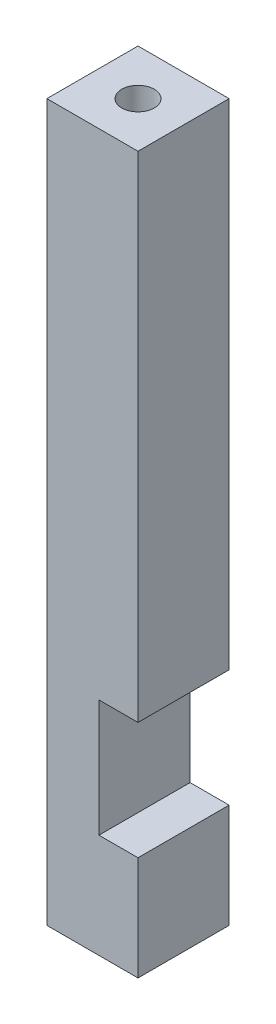
ISO-10303-21;
HEADER;
FILE_DESCRIPTION(('STEP AP214'),'2;1');
FILE_NAME('part.step','',(''),(''),'','','');
FILE_SCHEMA(('AUTOMOTIVE_DESIGN { 1 0 10303 214 1 1 1 1 }'));
ENDSEC;
DATA;
#1=APPLICATION_CONTEXT('core data for automotive mechanical design processes');
#2=APPLICATION_PROTOCOL_DEFINITION('international standard','automotive_design',2000,#1);
#3=PRODUCT_CONTEXT('',#1,'mechanical');
#4=PRODUCT('Part','Part','',(#3));
#5=PRODUCT_RELATED_PRODUCT_CATEGORY('part','',(#4));
#6=PRODUCT_DEFINITION_FORMATION('','',#4);
#7=PRODUCT_DEFINITION_CONTEXT('part definition',#1,'design');
#8=PRODUCT_DEFINITION('design','',#6,#7);
#9=PRODUCT_DEFINITION_SHAPE('','',#8);
#10=(LENGTH_UNIT() NAMED_UNIT(*) SI_UNIT(.MILLI.,.METRE.));
#11=(NAMED_UNIT(*) PLANE_ANGLE_UNIT() SI_UNIT($,.RADIAN.));
#12=(NAMED_UNIT(*) SI_UNIT($,.STERADIAN.) SOLID_ANGLE_UNIT());
#13=UNCERTAINTY_MEASURE_WITH_UNIT(LENGTH_MEASURE(1.E-05),#10,'distance_accuracy_value','');
#14=(GEOMETRIC_REPRESENTATION_CONTEXT(3) GLOBAL_UNCERTAINTY_ASSIGNED_CONTEXT((#13)) GLOBAL_UNIT_ASSIGNED_CONTEXT((#10,
#11,#12)) REPRESENTATION_CONTEXT('',''));
#15=CARTESIAN_POINT('',(0.,0.,0.));
#16=DIRECTION('',(0.,0.,1.));
#17=DIRECTION('',(1.,0.,0.));
#18=AXIS2_PLACEMENT_3D('',#15,#16,#17);
#19=CARTESIAN_POINT('',(3.5,55.,3.5));
#20=DIRECTION('',(-1.,0.,0.));
#21=DIRECTION('',(0.,0.,1.));
#22=AXIS2_PLACEMENT_3D('',#19,#20,#21);
#23=PLANE('',#22);
#24=DIRECTION('',(0.,-1.,0.));
#25=VECTOR('',#24,1.);
#26=CARTESIAN_POINT('',(3.5,55.,-3.5));
#27=LINE('',#26,#25);
#28=CARTESIAN_POINT('',(3.5,8.,-3.5));
#29=VERTEX_POINT('',#28);
#30=CARTESIAN_POINT('',(3.5,0.,-3.5));
#31=VERTEX_POINT('',#30);
#32=EDGE_CURVE('E85',#29,#31,#27,.T.);
#33=ORIENTED_EDGE('',*,*,#32,.F.);
#34=DIRECTION('',(0.,0.,-1.));
#35=VECTOR('',#34,1.);
#36=CARTESIAN_POINT('',(3.5,8.,0.));
#37=LINE('',#36,#35);
#38=CARTESIAN_POINT('',(3.5,8.,3.5));
#39=VERTEX_POINT('',#38);
#40=EDGE_CURVE('E128',#39,#29,#37,.T.);
#41=ORIENTED_EDGE('',*,*,#40,.F.);
#42=DIRECTION('',(0.,-1.,0.));
#43=VECTOR('',#42,1.);
#44=CARTESIAN_POINT('',(3.5,55.,3.5));
#45=LINE('',#44,#43);
#46=CARTESIAN_POINT('',(3.5,0.,3.5));
#47=VERTEX_POINT('',#46);
#48=EDGE_CURVE('E176',#39,#47,#45,.T.);
#49=ORIENTED_EDGE('',*,*,#48,.T.);
#50=DIRECTION('',(0.,0.,-1.));
#51=VECTOR('',#50,1.);
#52=CARTESIAN_POINT('',(3.5,0.,3.5));
#53=LINE('',#52,#51);
#54=EDGE_CURVE('E154',#47,#31,#53,.T.);
#55=ORIENTED_EDGE('',*,*,#54,.T.);
#56=EDGE_LOOP('',(#33,#41,#49,#55));
#57=FACE_BOUND('',#56,.T.);
#58=ADVANCED_FACE('F39',(#57),#23,.F.);
#59=CARTESIAN_POINT('',(0.,55.,-3.5));
#60=DIRECTION('',(0.,0.,1.));
#61=DIRECTION('',(1.,0.,0.));
#62=AXIS2_PLACEMENT_3D('',#59,#60,#61);
#63=PLANE('',#62);
#64=DIRECTION('',(0.,1.,0.));
#65=VECTOR('',#64,1.);
#66=CARTESIAN_POINT('',(0.5,0.,-3.5));
#67=LINE('',#66,#65);
#68=CARTESIAN_POINT('',(0.5,8.,-3.5));
#69=VERTEX_POINT('',#68);
#70=CARTESIAN_POINT('',(0.5,17.,-3.5));
#71=VERTEX_POINT('',#70);
#72=EDGE_CURVE('E120',#69,#71,#67,.T.);
#73=ORIENTED_EDGE('',*,*,#72,.F.);
#74=DIRECTION('',(1.,0.,0.));
#75=VECTOR('',#74,1.);
#76=CARTESIAN_POINT('',(0.5,8.,-3.5));
#77=LINE('',#76,#75);
#78=EDGE_CURVE('E150',#69,#29,#77,.T.);
#79=ORIENTED_EDGE('',*,*,#78,.T.);
#80=ORIENTED_EDGE('',*,*,#32,.T.);
#81=DIRECTION('',(-1.,0.,0.));
#82=VECTOR('',#81,1.);
#83=CARTESIAN_POINT('',(0.,0.,-3.5));
#84=LINE('',#83,#82);
#85=CARTESIAN_POINT('',(-3.5,0.,-3.5));
#86=VERTEX_POINT('',#85);
#87=EDGE_CURVE('E145',#31,#86,#84,.T.);
#88=ORIENTED_EDGE('',*,*,#87,.T.);
#89=DIRECTION('',(0.,-1.,0.));
#90=VECTOR('',#89,1.);
#91=CARTESIAN_POINT('',(-3.5,55.,-3.5));
#92=LINE('',#91,#90);
#93=CARTESIAN_POINT('',(-3.5,55.,-3.5));
#94=VERTEX_POINT('',#93);
#95=EDGE_CURVE('E11',#94,#86,#92,.T.);
#96=ORIENTED_EDGE('',*,*,#95,.F.);
#97=DIRECTION('',(-1.,0.,0.));
#98=VECTOR('',#97,1.);
#99=CARTESIAN_POINT('',(3.5,55.,-3.5));
#100=LINE('',#99,#98);
#101=CARTESIAN_POINT('',(3.5,55.,-3.5));
#102=VERTEX_POINT('',#101);
#103=EDGE_CURVE('E90',#102,#94,#100,.T.);
#104=ORIENTED_EDGE('',*,*,#103,.F.);
#105=CARTESIAN_POINT('',(3.5,17.,-3.5));
#106=VERTEX_POINT('',#105);
#107=EDGE_CURVE('E131',#102,#106,#27,.T.);
#108=ORIENTED_EDGE('',*,*,#107,.T.);
#109=DIRECTION('',(1.,0.,0.));
#110=VECTOR('',#109,1.);
#111=CARTESIAN_POINT('',(0.5,17.,-3.5));
#112=LINE('',#111,#110);
#113=EDGE_CURVE('E55',#71,#106,#112,.T.);
#114=ORIENTED_EDGE('',*,*,#113,.F.);
#115=EDGE_LOOP('',(#73,#79,#80,#88,#96,#104,#108,#114));
#116=FACE_BOUND('',#115,.T.);
#117=ADVANCED_FACE('F41',(#116),#63,.F.);
#118=CARTESIAN_POINT('',(-3.5,55.,-3.5));
#119=DIRECTION('',(1.,0.,0.));
#120=DIRECTION('',(0.,0.,-1.));
#121=AXIS2_PLACEMENT_3D('',#118,#119,#120);
#122=PLANE('',#121);
#123=DIRECTION('',(0.,0.,1.));
#124=VECTOR('',#123,1.);
#125=CARTESIAN_POINT('',(-3.5,0.,-3.5));
#126=LINE('',#125,#124);
#127=CARTESIAN_POINT('',(-3.5,0.,3.5));
#128=VERTEX_POINT('',#127);
#129=EDGE_CURVE('E164',#86,#128,#126,.T.);
#130=ORIENTED_EDGE('',*,*,#129,.T.);
#131=DIRECTION('',(0.,-1.,0.));
#132=VECTOR('',#131,1.);
#133=CARTESIAN_POINT('',(-3.5,55.,3.5));
#134=LINE('',#133,#132);
#135=CARTESIAN_POINT('',(-3.5,55.,3.5));
#136=VERTEX_POINT('',#135);
#137=EDGE_CURVE('E48',#136,#128,#134,.T.);
#138=ORIENTED_EDGE('',*,*,#137,.F.);
#139=DIRECTION('',(0.,0.,1.));
#140=VECTOR('',#139,1.);
#141=CARTESIAN_POINT('',(-3.5,55.,-3.5));
#142=LINE('',#141,#140);
#143=EDGE_CURVE('E153',#94,#136,#142,.T.);
#144=ORIENTED_EDGE('',*,*,#143,.F.);
#145=ORIENTED_EDGE('',*,*,#95,.T.);
#146=EDGE_LOOP('',(#130,#138,#144,#145));
#147=FACE_BOUND('',#146,.T.);
#148=ADVANCED_FACE('F248',(#147),#122,.F.);
#149=CARTESIAN_POINT('',(-3.5,55.,3.5));
#150=DIRECTION('',(0.,0.,-1.));
#151=DIRECTION('',(-1.,0.,0.));
#152=AXIS2_PLACEMENT_3D('',#149,#150,#151);
#153=PLANE('',#152);
#154=ORIENTED_EDGE('',*,*,#48,.F.);
#155=DIRECTION('',(1.,0.,0.));
#156=VECTOR('',#155,1.);
#157=CARTESIAN_POINT('',(0.5,8.,3.5));
#158=LINE('',#157,#156);
#159=CARTESIAN_POINT('',(0.5,8.,3.5));
#160=VERTEX_POINT('',#159);
#161=EDGE_CURVE('E136',#160,#39,#158,.T.);
#162=ORIENTED_EDGE('',*,*,#161,.F.);
#163=DIRECTION('',(0.,-1.,0.));
#164=VECTOR('',#163,1.);
#165=CARTESIAN_POINT('',(0.5,0.,3.5));
#166=LINE('',#165,#164);
#167=CARTESIAN_POINT('',(0.5,17.,3.5));
#168=VERTEX_POINT('',#167);
#169=EDGE_CURVE('E119',#168,#160,#166,.T.);
#170=ORIENTED_EDGE('',*,*,#169,.F.);
#171=DIRECTION('',(1.,0.,0.));
#172=VECTOR('',#171,1.);
#173=CARTESIAN_POINT('',(0.5,17.,3.5));
#174=LINE('',#173,#172);
#175=CARTESIAN_POINT('',(3.5,17.,3.5));
#176=VERTEX_POINT('',#175);
#177=EDGE_CURVE('E115',#168,#176,#174,.T.);
#178=ORIENTED_EDGE('',*,*,#177,.T.);
#179=CARTESIAN_POINT('',(3.5,55.,3.5));
#180=VERTEX_POINT('',#179);
#181=EDGE_CURVE('E177',#180,#176,#45,.T.);
#182=ORIENTED_EDGE('',*,*,#181,.F.);
#183=DIRECTION('',(1.,0.,0.));
#184=VECTOR('',#183,1.);
#185=CARTESIAN_POINT('',(-3.5,55.,3.5));
#186=LINE('',#185,#184);
#187=EDGE_CURVE('E157',#136,#180,#186,.T.);
#188=ORIENTED_EDGE('',*,*,#187,.F.);
#189=ORIENTED_EDGE('',*,*,#137,.T.);
#190=DIRECTION('',(1.,0.,0.));
#191=VECTOR('',#190,1.);
#192=CARTESIAN_POINT('',(-3.5,0.,3.5));
#193=LINE('',#192,#191);
#194=EDGE_CURVE('E167',#128,#47,#193,.T.);
#195=ORIENTED_EDGE('',*,*,#194,.T.);
#196=EDGE_LOOP('',(#154,#162,#170,#178,#182,#188,#189,#195));
#197=FACE_BOUND('',#196,.T.);
#198=ADVANCED_FACE('F187',(#197),#153,.F.);
#199=ORIENTED_EDGE('',*,*,#181,.T.);
#200=DIRECTION('',(0.,0.,1.));
#201=VECTOR('',#200,1.);
#202=CARTESIAN_POINT('',(3.5,17.,0.));
#203=LINE('',#202,#201);
#204=EDGE_CURVE('E207',#106,#176,#203,.T.);
#205=ORIENTED_EDGE('',*,*,#204,.F.);
#206=ORIENTED_EDGE('',*,*,#107,.F.);
#207=DIRECTION('',(0.,0.,-1.));
#208=VECTOR('',#207,1.);
#209=CARTESIAN_POINT('',(3.5,55.,3.5));
#210=LINE('',#209,#208);
#211=EDGE_CURVE('E64',#180,#102,#210,.T.);
#212=ORIENTED_EDGE('',*,*,#211,.F.);
#213=EDGE_LOOP('',(#199,#205,#206,#212));
#214=FACE_BOUND('',#213,.T.);
#215=ADVANCED_FACE('F240',(#214),#23,.F.);
#216=CARTESIAN_POINT('',(0.,55.,0.));
#217=DIRECTION('',(0.,1.,0.));
#218=DIRECTION('',(0.,0.,1.));
#219=AXIS2_PLACEMENT_3D('',#216,#217,#218);
#220=PLANE('',#219);
#221=CARTESIAN_POINT('',(0.,55.,0.));
#222=DIRECTION('',(0.,1.,0.));
#223=DIRECTION('',(0.,0.,1.));
#224=AXIS2_PLACEMENT_3D('',#221,#222,#223);
#225=CIRCLE('',#224,1.25);
#226=CARTESIAN_POINT('',(0.,55.,1.25));
#227=VERTEX_POINT('',#226);
#228=EDGE_CURVE('E146',#227,#227,#225,.T.);
#229=ORIENTED_EDGE('',*,*,#228,.F.);
#230=EDGE_LOOP('',(#229));
#231=FACE_BOUND('',#230,.T.);
#232=ORIENTED_EDGE('',*,*,#103,.T.);
#233=ORIENTED_EDGE('',*,*,#143,.T.);
#234=ORIENTED_EDGE('',*,*,#187,.T.);
#235=ORIENTED_EDGE('',*,*,#211,.T.);
#236=EDGE_LOOP('',(#232,#233,#234,#235));
#237=FACE_BOUND('',#236,.T.);
#238=ADVANCED_FACE('F231',(#231,#237),#220,.T.);
#239=CARTESIAN_POINT('',(0.,0.,0.));
#240=DIRECTION('',(0.,1.,0.));
#241=DIRECTION('',(0.,0.,1.));
#242=AXIS2_PLACEMENT_3D('',#239,#240,#241);
#243=PLANE('',#242);
#244=CARTESIAN_POINT('',(0.,0.,0.));
#245=DIRECTION('',(0.,-1.,0.));
#246=DIRECTION('',(0.,0.,-1.));
#247=AXIS2_PLACEMENT_3D('',#244,#245,#246);
#248=CIRCLE('',#247,1.25);
#249=CARTESIAN_POINT('',(0.,0.,-1.25));
#250=VERTEX_POINT('',#249);
#251=EDGE_CURVE('E213',#250,#250,#248,.T.);
#252=ORIENTED_EDGE('',*,*,#251,.F.);
#253=EDGE_LOOP('',(#252));
#254=FACE_BOUND('',#253,.T.);
#255=ORIENTED_EDGE('',*,*,#87,.F.);
#256=ORIENTED_EDGE('',*,*,#54,.F.);
#257=ORIENTED_EDGE('',*,*,#194,.F.);
#258=ORIENTED_EDGE('',*,*,#129,.F.);
#259=EDGE_LOOP('',(#255,#256,#257,#258));
#260=FACE_BOUND('',#259,.T.);
#261=ADVANCED_FACE('F194',(#254,#260),#243,.F.);
#262=CARTESIAN_POINT('',(0.,43.,0.));
#263=DIRECTION('',(0.,1.,0.));
#264=DIRECTION('',(0.,0.,1.));
#265=AXIS2_PLACEMENT_3D('',#262,#263,#264);
#266=CYLINDRICAL_SURFACE('',#265,1.25);
#267=CARTESIAN_POINT('',(0.,43.,0.));
#268=DIRECTION('',(0.,1.,0.));
#269=DIRECTION('',(0.,0.,1.));
#270=AXIS2_PLACEMENT_3D('',#267,#268,#269);
#271=CIRCLE('',#270,1.25);
#272=CARTESIAN_POINT('',(0.,43.,1.25));
#273=VERTEX_POINT('',#272);
#274=EDGE_CURVE('E141',#273,#273,#271,.T.);
#275=ORIENTED_EDGE('',*,*,#274,.F.);
#276=EDGE_LOOP('',(#275));
#277=FACE_BOUND('',#276,.T.);
#278=ORIENTED_EDGE('',*,*,#228,.T.);
#279=EDGE_LOOP('',(#278));
#280=FACE_BOUND('',#279,.T.);
#281=ADVANCED_FACE('F230',(#277,#280),#266,.F.);
#282=CARTESIAN_POINT('',(0.,43.,0.));
#283=DIRECTION('',(0.,1.,0.));
#284=DIRECTION('',(0.,0.,1.));
#285=AXIS2_PLACEMENT_3D('',#282,#283,#284);
#286=PLANE('',#285);
#287=ORIENTED_EDGE('',*,*,#274,.T.);
#288=EDGE_LOOP('',(#287));
#289=FACE_BOUND('',#288,.T.);
#290=ADVANCED_FACE('F237',(#289),#286,.T.);
#291=CARTESIAN_POINT('',(0.5,8.,0.));
#292=DIRECTION('',(0.,-1.,0.));
#293=DIRECTION('',(0.,0.,-1.));
#294=AXIS2_PLACEMENT_3D('',#291,#292,#293);
#295=PLANE('',#294);
#296=ORIENTED_EDGE('',*,*,#40,.T.);
#297=ORIENTED_EDGE('',*,*,#78,.F.);
#298=DIRECTION('',(0.,0.,-1.));
#299=VECTOR('',#298,1.);
#300=CARTESIAN_POINT('',(0.5,8.,0.));
#301=LINE('',#300,#299);
#302=EDGE_CURVE('E126',#160,#69,#301,.T.);
#303=ORIENTED_EDGE('',*,*,#302,.F.);
#304=ORIENTED_EDGE('',*,*,#161,.T.);
#305=EDGE_LOOP('',(#296,#297,#303,#304));
#306=FACE_BOUND('',#305,.T.);
#307=ADVANCED_FACE('F255',(#306),#295,.F.);
#308=CARTESIAN_POINT('',(0.5,17.,0.));
#309=DIRECTION('',(0.,1.,0.));
#310=DIRECTION('',(0.,0.,1.));
#311=AXIS2_PLACEMENT_3D('',#308,#309,#310);
#312=PLANE('',#311);
#313=ORIENTED_EDGE('',*,*,#204,.T.);
#314=ORIENTED_EDGE('',*,*,#177,.F.);
#315=DIRECTION('',(0.,0.,1.));
#316=VECTOR('',#315,1.);
#317=CARTESIAN_POINT('',(0.5,17.,0.));
#318=LINE('',#317,#316);
#319=EDGE_CURVE('E111',#71,#168,#318,.T.);
#320=ORIENTED_EDGE('',*,*,#319,.F.);
#321=ORIENTED_EDGE('',*,*,#113,.T.);
#322=EDGE_LOOP('',(#313,#314,#320,#321));
#323=FACE_BOUND('',#322,.T.);
#324=ADVANCED_FACE('F113',(#323),#312,.F.);
#325=CARTESIAN_POINT('',(0.5,0.,0.));
#326=DIRECTION('',(1.,0.,0.));
#327=DIRECTION('',(0.,0.,-1.));
#328=AXIS2_PLACEMENT_3D('',#325,#326,#327);
#329=PLANE('',#328);
#330=ORIENTED_EDGE('',*,*,#72,.T.);
#331=ORIENTED_EDGE('',*,*,#319,.T.);
#332=ORIENTED_EDGE('',*,*,#169,.T.);
#333=ORIENTED_EDGE('',*,*,#302,.T.);
#334=EDGE_LOOP('',(#330,#331,#332,#333));
#335=FACE_BOUND('',#334,.T.);
#336=ADVANCED_FACE('F124',(#335),#329,.T.);
#337=CARTESIAN_POINT('',(0.,5.,0.));
#338=DIRECTION('',(0.,-1.,0.));
#339=DIRECTION('',(0.,0.,-1.));
#340=AXIS2_PLACEMENT_3D('',#337,#338,#339);
#341=CYLINDRICAL_SURFACE('',#340,1.25);
#342=CARTESIAN_POINT('',(0.,5.,0.));
#343=DIRECTION('',(0.,-1.,0.));
#344=DIRECTION('',(0.,0.,-1.));
#345=AXIS2_PLACEMENT_3D('',#342,#343,#344);
#346=CIRCLE('',#345,1.25);
#347=CARTESIAN_POINT('',(0.,5.,-1.25));
#348=VERTEX_POINT('',#347);
#349=EDGE_CURVE('E209',#348,#348,#346,.T.);
#350=ORIENTED_EDGE('',*,*,#349,.F.);
#351=EDGE_LOOP('',(#350));
#352=FACE_BOUND('',#351,.T.);
#353=ORIENTED_EDGE('',*,*,#251,.T.);
#354=EDGE_LOOP('',(#353));
#355=FACE_BOUND('',#354,.T.);
#356=ADVANCED_FACE('F223',(#352,#355),#341,.F.);
#357=CARTESIAN_POINT('',(0.,5.,0.));
#358=DIRECTION('',(0.,-1.,0.));
#359=DIRECTION('',(0.,0.,-1.));
#360=AXIS2_PLACEMENT_3D('',#357,#358,#359);
#361=PLANE('',#360);
#362=ORIENTED_EDGE('',*,*,#349,.T.);
#363=EDGE_LOOP('',(#362));
#364=FACE_BOUND('',#363,.T.);
#365=ADVANCED_FACE('F221',(#364),#361,.T.);
#366=CLOSED_SHELL('',(#58,#117,#148,#198,#215,#238,#261,#281,#290,#307,#324,#336,#356,#365));
#367=MANIFOLD_SOLID_BREP('B2',#366);
#368=ADVANCED_BREP_SHAPE_REPRESENTATION('',(#18,#367),#14);
#369=SHAPE_DEFINITION_REPRESENTATION(#9,#368);
ENDSEC;
END-ISO-10303-21;
